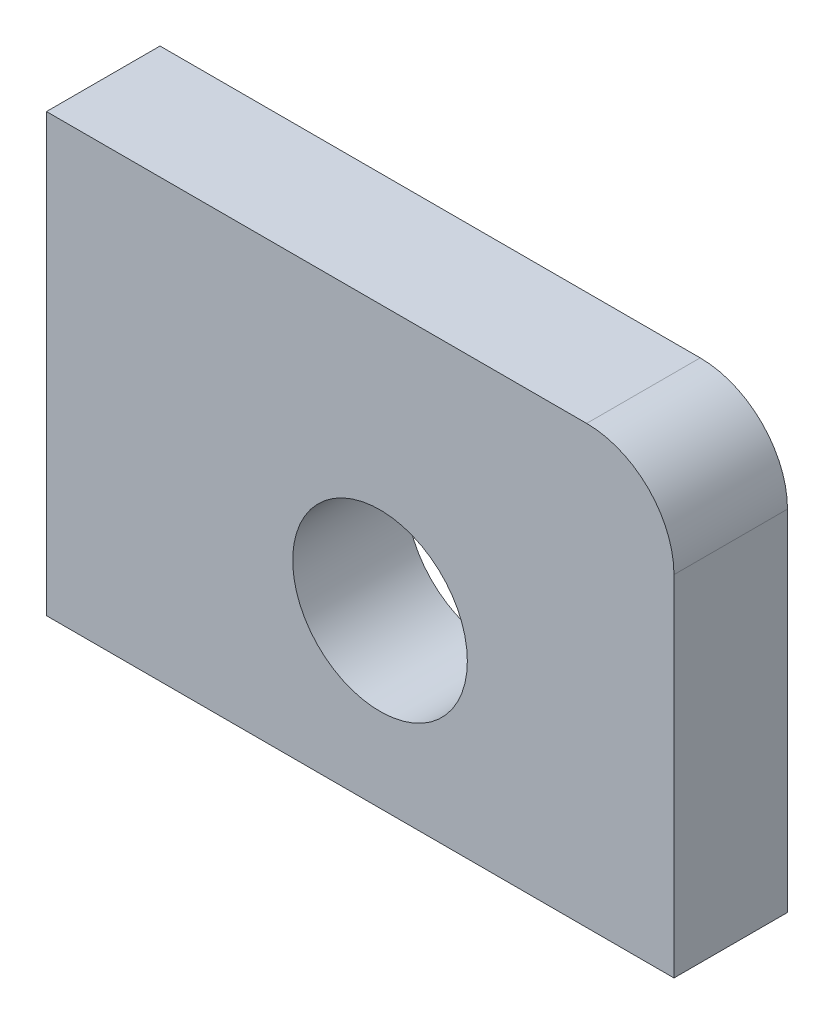
ISO-10303-21;
HEADER;
FILE_DESCRIPTION(('STEP AP214'),'2;1');
FILE_NAME('part.step','',(''),(''),'','','');
FILE_SCHEMA(('AUTOMOTIVE_DESIGN { 1 0 10303 214 1 1 1 1 }'));
ENDSEC;
DATA;
#1=APPLICATION_CONTEXT('core data for automotive mechanical design processes');
#2=APPLICATION_PROTOCOL_DEFINITION('international standard','automotive_design',2000,#1);
#3=PRODUCT_CONTEXT('',#1,'mechanical');
#4=PRODUCT('Part','Part','',(#3));
#5=PRODUCT_RELATED_PRODUCT_CATEGORY('part','',(#4));
#6=PRODUCT_DEFINITION_FORMATION('','',#4);
#7=PRODUCT_DEFINITION_CONTEXT('part definition',#1,'design');
#8=PRODUCT_DEFINITION('design','',#6,#7);
#9=PRODUCT_DEFINITION_SHAPE('','',#8);
#10=(LENGTH_UNIT() NAMED_UNIT(*) SI_UNIT(.MILLI.,.METRE.));
#11=(NAMED_UNIT(*) PLANE_ANGLE_UNIT() SI_UNIT($,.RADIAN.));
#12=(NAMED_UNIT(*) SI_UNIT($,.STERADIAN.) SOLID_ANGLE_UNIT());
#13=UNCERTAINTY_MEASURE_WITH_UNIT(LENGTH_MEASURE(1.E-05),#10,'distance_accuracy_value','');
#14=(GEOMETRIC_REPRESENTATION_CONTEXT(3) GLOBAL_UNCERTAINTY_ASSIGNED_CONTEXT((#13)) GLOBAL_UNIT_ASSIGNED_CONTEXT((#10,
#11,#12)) REPRESENTATION_CONTEXT('',''));
#15=CARTESIAN_POINT('',(0.,0.,0.));
#16=DIRECTION('',(0.,0.,1.));
#17=DIRECTION('',(1.,0.,0.));
#18=AXIS2_PLACEMENT_3D('',#15,#16,#17);
#19=CARTESIAN_POINT('',(31.7260764316779,20.3951738796968,13.));
#20=DIRECTION('',(0.,0.,-1.));
#21=DIRECTION('',(-1.,0.,0.));
#22=AXIS2_PLACEMENT_3D('',#19,#20,#21);
#23=CYLINDRICAL_SURFACE('',#22,10.);
#24=DIRECTION('',(0.,0.,-1.));
#25=VECTOR('',#24,1.);
#26=CARTESIAN_POINT('',(31.7260764316779,30.3951738796968,13.));
#27=LINE('',#26,#25);
#28=CARTESIAN_POINT('',(31.7260764316779,30.3951738796968,13.));
#29=VERTEX_POINT('',#28);
#30=CARTESIAN_POINT('',(31.7260764316779,30.3951738796968,0.));
#31=VERTEX_POINT('',#30);
#32=EDGE_CURVE('E114',#29,#31,#27,.T.);
#33=ORIENTED_EDGE('',*,*,#32,.F.);
#34=CARTESIAN_POINT('',(31.7260764316779,20.3951738796968,13.));
#35=DIRECTION('',(0.,0.,1.));
#36=DIRECTION('',(1.,0.,0.));
#37=AXIS2_PLACEMENT_3D('',#34,#35,#36);
#38=CIRCLE('',#37,10.);
#39=CARTESIAN_POINT('',(41.7260764316779,20.3951738796968,13.));
#40=VERTEX_POINT('',#39);
#41=EDGE_CURVE('E42',#40,#29,#38,.T.);
#42=ORIENTED_EDGE('',*,*,#41,.F.);
#43=DIRECTION('',(0.,0.,-1.));
#44=VECTOR('',#43,1.);
#45=CARTESIAN_POINT('',(41.7260764316779,20.3951738796968,13.));
#46=LINE('',#45,#44);
#47=CARTESIAN_POINT('',(41.7260764316779,20.3951738796968,0.));
#48=VERTEX_POINT('',#47);
#49=EDGE_CURVE('E117',#48,#40,#46,.F.);
#50=ORIENTED_EDGE('',*,*,#49,.F.);
#51=CARTESIAN_POINT('',(31.7260764316779,20.3951738796968,0.));
#52=DIRECTION('',(0.,0.,1.));
#53=DIRECTION('',(1.,0.,0.));
#54=AXIS2_PLACEMENT_3D('',#51,#52,#53);
#55=CIRCLE('',#54,10.);
#56=EDGE_CURVE('E11',#31,#48,#55,.F.);
#57=ORIENTED_EDGE('',*,*,#56,.F.);
#58=EDGE_LOOP('',(#33,#42,#50,#57));
#59=FACE_BOUND('',#58,.T.);
#60=ADVANCED_FACE('F35',(#59),#23,.T.);
#61=CARTESIAN_POINT('',(-58.2739235683221,-19.6048261203032,13.));
#62=DIRECTION('',(0.,1.,0.));
#63=DIRECTION('',(-1.,0.,0.));
#64=AXIS2_PLACEMENT_3D('',#61,#62,#63);
#65=PLANE('',#64);
#66=DIRECTION('',(1.,0.,0.));
#67=VECTOR('',#66,1.);
#68=CARTESIAN_POINT('',(-58.2739235683221,-19.6048261203032,13.));
#69=LINE('',#68,#67);
#70=CARTESIAN_POINT('',(-30.128561804446,-19.6048261203032,13.));
#71=VERTEX_POINT('',#70);
#72=CARTESIAN_POINT('',(41.7260764316779,-19.6048261203032,13.));
#73=VERTEX_POINT('',#72);
#74=EDGE_CURVE('E94',#71,#73,#69,.T.);
#75=ORIENTED_EDGE('',*,*,#74,.F.);
#76=DIRECTION('',(0.,0.,1.));
#77=VECTOR('',#76,1.);
#78=CARTESIAN_POINT('',(-30.128561804446,-19.6048261203032,0.));
#79=LINE('',#78,#77);
#80=CARTESIAN_POINT('',(-30.128561804446,-19.6048261203032,0.));
#81=VERTEX_POINT('',#80);
#82=EDGE_CURVE('E80',#81,#71,#79,.T.);
#83=ORIENTED_EDGE('',*,*,#82,.F.);
#84=DIRECTION('',(1.,0.,0.));
#85=VECTOR('',#84,1.);
#86=CARTESIAN_POINT('',(-58.2739235683221,-19.6048261203032,0.));
#87=LINE('',#86,#85);
#88=CARTESIAN_POINT('',(41.7260764316779,-19.6048261203032,0.));
#89=VERTEX_POINT('',#88);
#90=EDGE_CURVE('E92',#81,#89,#87,.T.);
#91=ORIENTED_EDGE('',*,*,#90,.T.);
#92=DIRECTION('',(0.,0.,-1.));
#93=VECTOR('',#92,1.);
#94=CARTESIAN_POINT('',(41.7260764316779,-19.6048261203032,13.));
#95=LINE('',#94,#93);
#96=EDGE_CURVE('E112',#73,#89,#95,.T.);
#97=ORIENTED_EDGE('',*,*,#96,.F.);
#98=EDGE_LOOP('',(#75,#83,#91,#97));
#99=FACE_BOUND('',#98,.T.);
#100=ADVANCED_FACE('F90',(#99),#65,.F.);
#101=CARTESIAN_POINT('',(41.7260764316779,30.3951738796968,13.));
#102=DIRECTION('',(-1.,0.,0.));
#103=DIRECTION('',(0.,0.,1.));
#104=AXIS2_PLACEMENT_3D('',#101,#102,#103);
#105=PLANE('',#104);
#106=DIRECTION('',(0.,1.,0.));
#107=VECTOR('',#106,1.);
#108=CARTESIAN_POINT('',(41.7260764316779,30.3951738796968,0.));
#109=LINE('',#108,#107);
#110=EDGE_CURVE('E99',#89,#48,#109,.T.);
#111=ORIENTED_EDGE('',*,*,#110,.T.);
#112=ORIENTED_EDGE('',*,*,#49,.T.);
#113=DIRECTION('',(0.,1.,0.));
#114=VECTOR('',#113,1.);
#115=CARTESIAN_POINT('',(41.7260764316779,30.3951738796968,13.));
#116=LINE('',#115,#114);
#117=EDGE_CURVE('E125',#73,#40,#116,.T.);
#118=ORIENTED_EDGE('',*,*,#117,.F.);
#119=ORIENTED_EDGE('',*,*,#96,.T.);
#120=EDGE_LOOP('',(#111,#112,#118,#119));
#121=FACE_BOUND('',#120,.T.);
#122=ADVANCED_FACE('F134',(#121),#105,.F.);
#123=CARTESIAN_POINT('',(-58.2739235683221,30.3951738796968,13.));
#124=DIRECTION('',(0.,-1.,0.));
#125=DIRECTION('',(0.,0.,-1.));
#126=AXIS2_PLACEMENT_3D('',#123,#124,#125);
#127=PLANE('',#126);
#128=DIRECTION('',(-1.,0.,0.));
#129=VECTOR('',#128,1.);
#130=CARTESIAN_POINT('',(-58.2739235683221,30.3951738796968,0.));
#131=LINE('',#130,#129);
#132=CARTESIAN_POINT('',(-30.128561804446,30.3951738796968,0.));
#133=VERTEX_POINT('',#132);
#134=EDGE_CURVE('E102',#31,#133,#131,.T.);
#135=ORIENTED_EDGE('',*,*,#134,.T.);
#136=DIRECTION('',(0.,0.,1.));
#137=VECTOR('',#136,1.);
#138=CARTESIAN_POINT('',(-30.128561804446,30.3951738796968,0.));
#139=LINE('',#138,#137);
#140=CARTESIAN_POINT('',(-30.128561804446,30.3951738796968,13.));
#141=VERTEX_POINT('',#140);
#142=EDGE_CURVE('E49',#133,#141,#139,.T.);
#143=ORIENTED_EDGE('',*,*,#142,.T.);
#144=DIRECTION('',(-1.,0.,0.));
#145=VECTOR('',#144,1.);
#146=CARTESIAN_POINT('',(-58.2739235683221,30.3951738796968,13.));
#147=LINE('',#146,#145);
#148=EDGE_CURVE('E108',#29,#141,#147,.T.);
#149=ORIENTED_EDGE('',*,*,#148,.F.);
#150=ORIENTED_EDGE('',*,*,#32,.T.);
#151=EDGE_LOOP('',(#135,#143,#149,#150));
#152=FACE_BOUND('',#151,.T.);
#153=ADVANCED_FACE('F127',(#152),#127,.F.);
#154=CARTESIAN_POINT('',(0.,0.,13.));
#155=DIRECTION('',(0.,0.,1.));
#156=DIRECTION('',(1.,0.,0.));
#157=AXIS2_PLACEMENT_3D('',#154,#155,#156);
#158=PLANE('',#157);
#159=DIRECTION('',(0.,1.,0.));
#160=VECTOR('',#159,1.);
#161=CARTESIAN_POINT('',(-30.128561804446,30.3951738796968,13.));
#162=LINE('',#161,#160);
#163=EDGE_CURVE('E86',#71,#141,#162,.T.);
#164=ORIENTED_EDGE('',*,*,#163,.F.);
#165=ORIENTED_EDGE('',*,*,#74,.T.);
#166=ORIENTED_EDGE('',*,*,#117,.T.);
#167=ORIENTED_EDGE('',*,*,#41,.T.);
#168=ORIENTED_EDGE('',*,*,#148,.T.);
#169=EDGE_LOOP('',(#164,#165,#166,#167,#168));
#170=FACE_BOUND('',#169,.T.);
#171=CARTESIAN_POINT('',(8.06462643652139,0.,13.));
#172=DIRECTION('',(0.,0.,1.));
#173=DIRECTION('',(1.,0.,0.));
#174=AXIS2_PLACEMENT_3D('',#171,#172,#173);
#175=CIRCLE('',#174,10.);
#176=CARTESIAN_POINT('',(18.0646264365214,0.,13.));
#177=VERTEX_POINT('',#176);
#178=EDGE_CURVE('E105',#177,#177,#175,.T.);
#179=ORIENTED_EDGE('',*,*,#178,.F.);
#180=EDGE_LOOP('',(#179));
#181=FACE_BOUND('',#180,.T.);
#182=ADVANCED_FACE('F121',(#170,#181),#158,.T.);
#183=CARTESIAN_POINT('',(0.,0.,0.));
#184=DIRECTION('',(0.,0.,1.));
#185=DIRECTION('',(1.,0.,0.));
#186=AXIS2_PLACEMENT_3D('',#183,#184,#185);
#187=PLANE('',#186);
#188=CARTESIAN_POINT('',(8.06462643652139,0.,0.));
#189=DIRECTION('',(0.,0.,1.));
#190=DIRECTION('',(1.,0.,0.));
#191=AXIS2_PLACEMENT_3D('',#188,#189,#190);
#192=CIRCLE('',#191,10.);
#193=CARTESIAN_POINT('',(18.0646264365214,0.,0.));
#194=VERTEX_POINT('',#193);
#195=EDGE_CURVE('E100',#194,#194,#192,.T.);
#196=ORIENTED_EDGE('',*,*,#195,.T.);
#197=EDGE_LOOP('',(#196));
#198=FACE_BOUND('',#197,.T.);
#199=ORIENTED_EDGE('',*,*,#90,.F.);
#200=DIRECTION('',(0.,1.,0.));
#201=VECTOR('',#200,1.);
#202=CARTESIAN_POINT('',(-30.128561804446,30.3951738796968,0.));
#203=LINE('',#202,#201);
#204=EDGE_CURVE('E77',#81,#133,#203,.T.);
#205=ORIENTED_EDGE('',*,*,#204,.T.);
#206=ORIENTED_EDGE('',*,*,#134,.F.);
#207=ORIENTED_EDGE('',*,*,#56,.T.);
#208=ORIENTED_EDGE('',*,*,#110,.F.);
#209=EDGE_LOOP('',(#199,#205,#206,#207,#208));
#210=FACE_BOUND('',#209,.T.);
#211=ADVANCED_FACE('F97',(#198,#210),#187,.F.);
#212=CARTESIAN_POINT('',(8.06462643652139,0.,0.));
#213=DIRECTION('',(0.,0.,1.));
#214=DIRECTION('',(1.,0.,0.));
#215=AXIS2_PLACEMENT_3D('',#212,#213,#214);
#216=CYLINDRICAL_SURFACE('',#215,10.);
#217=ORIENTED_EDGE('',*,*,#195,.F.);
#218=EDGE_LOOP('',(#217));
#219=FACE_BOUND('',#218,.T.);
#220=ORIENTED_EDGE('',*,*,#178,.T.);
#221=EDGE_LOOP('',(#220));
#222=FACE_BOUND('',#221,.T.);
#223=ADVANCED_FACE('F156',(#219,#222),#216,.F.);
#224=CARTESIAN_POINT('',(-30.128561804446,30.3951738796968,0.));
#225=DIRECTION('',(1.,0.,0.));
#226=DIRECTION('',(0.,0.,-1.));
#227=AXIS2_PLACEMENT_3D('',#224,#225,#226);
#228=PLANE('',#227);
#229=ORIENTED_EDGE('',*,*,#163,.T.);
#230=ORIENTED_EDGE('',*,*,#142,.F.);
#231=ORIENTED_EDGE('',*,*,#204,.F.);
#232=ORIENTED_EDGE('',*,*,#82,.T.);
#233=EDGE_LOOP('',(#229,#230,#231,#232));
#234=FACE_BOUND('',#233,.T.);
#235=ADVANCED_FACE('F79',(#234),#228,.F.);
#236=CLOSED_SHELL('',(#60,#100,#122,#153,#182,#211,#223,#235));
#237=MANIFOLD_SOLID_BREP('B2',#236);
#238=ADVANCED_BREP_SHAPE_REPRESENTATION('',(#18,#237),#14);
#239=SHAPE_DEFINITION_REPRESENTATION(#9,#238);
ENDSEC;
END-ISO-10303-21;
